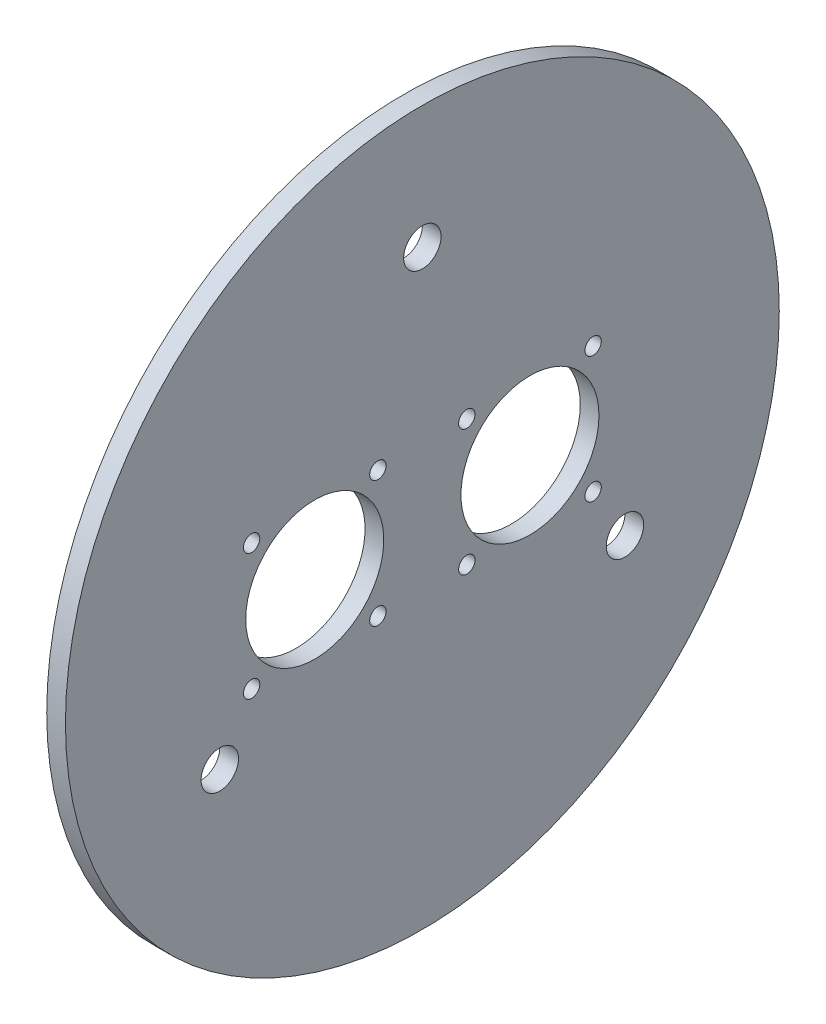
ISO-10303-21;
HEADER;
FILE_DESCRIPTION(('STEP AP214'),'2;1');
FILE_NAME('part.step','',(''),(''),'','','');
FILE_SCHEMA(('AUTOMOTIVE_DESIGN { 1 0 10303 214 1 1 1 1 }'));
ENDSEC;
DATA;
#1=APPLICATION_CONTEXT('core data for automotive mechanical design processes');
#2=APPLICATION_PROTOCOL_DEFINITION('international standard','automotive_design',2000,#1);
#3=PRODUCT_CONTEXT('',#1,'mechanical');
#4=PRODUCT('Part','Part','',(#3));
#5=PRODUCT_RELATED_PRODUCT_CATEGORY('part','',(#4));
#6=PRODUCT_DEFINITION_FORMATION('','',#4);
#7=PRODUCT_DEFINITION_CONTEXT('part definition',#1,'design');
#8=PRODUCT_DEFINITION('design','',#6,#7);
#9=PRODUCT_DEFINITION_SHAPE('','',#8);
#10=(LENGTH_UNIT() NAMED_UNIT(*) SI_UNIT(.MILLI.,.METRE.));
#11=(NAMED_UNIT(*) PLANE_ANGLE_UNIT() SI_UNIT($,.RADIAN.));
#12=(NAMED_UNIT(*) SI_UNIT($,.STERADIAN.) SOLID_ANGLE_UNIT());
#13=UNCERTAINTY_MEASURE_WITH_UNIT(LENGTH_MEASURE(1.E-05),#10,'distance_accuracy_value','');
#14=(GEOMETRIC_REPRESENTATION_CONTEXT(3) GLOBAL_UNCERTAINTY_ASSIGNED_CONTEXT((#13)) GLOBAL_UNIT_ASSIGNED_CONTEXT((#10,
#11,#12)) REPRESENTATION_CONTEXT('',''));
#15=CARTESIAN_POINT('',(0.,0.,0.));
#16=DIRECTION('',(0.,0.,1.));
#17=DIRECTION('',(1.,0.,0.));
#18=AXIS2_PLACEMENT_3D('',#15,#16,#17);
#19=CARTESIAN_POINT('',(4.,0.,0.));
#20=DIRECTION('',(1.,0.,0.));
#21=DIRECTION('',(0.,0.,-1.));
#22=AXIS2_PLACEMENT_3D('',#19,#20,#21);
#23=PLANE('',#22);
#24=CARTESIAN_POINT('',(4.,13.4969006858982,9.50309931410175));
#25=DIRECTION('',(1.,0.,0.));
#26=DIRECTION('',(0.,0.,1.));
#27=AXIS2_PLACEMENT_3D('',#24,#25,#26);
#28=CIRCLE('',#27,1.75000000000001);
#29=CARTESIAN_POINT('',(4.,13.4969006858982,11.2530993141018));
#30=VERTEX_POINT('',#29);
#31=EDGE_CURVE('E107',#30,#30,#28,.T.);
#32=ORIENTED_EDGE('',*,*,#31,.F.);
#33=EDGE_LOOP('',(#32));
#34=FACE_BOUND('',#33,.T.);
#35=CARTESIAN_POINT('',(4.,13.4969006858982,-9.50309931410175));
#36=DIRECTION('',(1.,0.,0.));
#37=DIRECTION('',(0.,0.,-1.));
#38=AXIS2_PLACEMENT_3D('',#35,#36,#37);
#39=CIRCLE('',#38,1.75000000000001);
#40=CARTESIAN_POINT('',(4.,13.4969006858982,-11.2530993141018));
#41=VERTEX_POINT('',#40);
#42=EDGE_CURVE('E95',#41,#41,#39,.T.);
#43=ORIENTED_EDGE('',*,*,#42,.F.);
#44=EDGE_LOOP('',(#43));
#45=FACE_BOUND('',#44,.T.);
#46=CARTESIAN_POINT('',(4.,-13.4969006858982,-36.4969006858983));
#47=DIRECTION('',(1.,0.,0.));
#48=DIRECTION('',(0.,0.,-1.));
#49=AXIS2_PLACEMENT_3D('',#46,#47,#48);
#50=CIRCLE('',#49,1.75);
#51=CARTESIAN_POINT('',(4.,-13.4969006858982,-38.2469006858983));
#52=VERTEX_POINT('',#51);
#53=EDGE_CURVE('E83',#52,#52,#50,.T.);
#54=ORIENTED_EDGE('',*,*,#53,.F.);
#55=EDGE_LOOP('',(#54));
#56=FACE_BOUND('',#55,.T.);
#57=CARTESIAN_POINT('',(4.,13.4969006858983,-36.4969006858982));
#58=DIRECTION('',(1.,0.,0.));
#59=DIRECTION('',(0.,0.,-1.));
#60=AXIS2_PLACEMENT_3D('',#57,#58,#59);
#61=CIRCLE('',#60,1.75);
#62=CARTESIAN_POINT('',(4.,13.4969006858983,-38.2469006858982));
#63=VERTEX_POINT('',#62);
#64=EDGE_CURVE('E71',#63,#63,#61,.T.);
#65=ORIENTED_EDGE('',*,*,#64,.F.);
#66=EDGE_LOOP('',(#65));
#67=FACE_BOUND('',#66,.T.);
#68=CARTESIAN_POINT('',(4.,0.,-23.));
#69=DIRECTION('',(1.,0.,0.));
#70=DIRECTION('',(0.,0.,-1.));
#71=AXIS2_PLACEMENT_3D('',#68,#69,#70);
#72=CIRCLE('',#71,14.75);
#73=CARTESIAN_POINT('',(4.,0.,-37.75));
#74=VERTEX_POINT('',#73);
#75=EDGE_CURVE('E59',#74,#74,#72,.T.);
#76=ORIENTED_EDGE('',*,*,#75,.F.);
#77=EDGE_LOOP('',(#76));
#78=FACE_BOUND('',#77,.T.);
#79=CARTESIAN_POINT('',(4.,-25.,-43.3012701892219));
#80=DIRECTION('',(1.,0.,0.));
#81=DIRECTION('',(0.,0.,-1.));
#82=AXIS2_PLACEMENT_3D('',#79,#80,#81);
#83=CIRCLE('',#82,4.00000000000001);
#84=CARTESIAN_POINT('',(4.,-25.,-47.301270189222));
#85=VERTEX_POINT('',#84);
#86=EDGE_CURVE('E47',#85,#85,#83,.T.);
#87=ORIENTED_EDGE('',*,*,#86,.F.);
#88=EDGE_LOOP('',(#87));
#89=FACE_BOUND('',#88,.T.);
#90=CARTESIAN_POINT('',(4.,0.,0.));
#91=DIRECTION('',(1.,0.,0.));
#92=DIRECTION('',(0.,0.,-1.));
#93=AXIS2_PLACEMENT_3D('',#90,#91,#92);
#94=CIRCLE('',#93,76.29);
#95=CARTESIAN_POINT('',(4.,0.,-76.29));
#96=VERTEX_POINT('',#95);
#97=EDGE_CURVE('E10',#96,#96,#94,.T.);
#98=ORIENTED_EDGE('',*,*,#97,.T.);
#99=EDGE_LOOP('',(#98));
#100=FACE_BOUND('',#99,.T.);
#101=CARTESIAN_POINT('',(4.,50.,0.));
#102=DIRECTION('',(1.,0.,0.));
#103=DIRECTION('',(0.,0.,-1.));
#104=AXIS2_PLACEMENT_3D('',#101,#102,#103);
#105=CIRCLE('',#104,4.00000000000001);
#106=CARTESIAN_POINT('',(4.,50.,-4.00000000000001));
#107=VERTEX_POINT('',#106);
#108=EDGE_CURVE('E42',#107,#107,#105,.T.);
#109=ORIENTED_EDGE('',*,*,#108,.F.);
#110=EDGE_LOOP('',(#109));
#111=FACE_BOUND('',#110,.T.);
#112=CARTESIAN_POINT('',(4.,-25.,43.3012701892219));
#113=DIRECTION('',(1.,0.,0.));
#114=DIRECTION('',(0.,0.,-1.));
#115=AXIS2_PLACEMENT_3D('',#112,#113,#114);
#116=CIRCLE('',#115,4.00000000000001);
#117=CARTESIAN_POINT('',(4.,-25.,39.3012701892219));
#118=VERTEX_POINT('',#117);
#119=EDGE_CURVE('E53',#118,#118,#116,.T.);
#120=ORIENTED_EDGE('',*,*,#119,.F.);
#121=EDGE_LOOP('',(#120));
#122=FACE_BOUND('',#121,.T.);
#123=CARTESIAN_POINT('',(4.,-13.4969006858982,36.4969006858983));
#124=DIRECTION('',(1.,0.,0.));
#125=DIRECTION('',(0.,0.,1.));
#126=AXIS2_PLACEMENT_3D('',#123,#124,#125);
#127=CIRCLE('',#126,1.75);
#128=CARTESIAN_POINT('',(4.,-13.4969006858982,38.2469006858983));
#129=VERTEX_POINT('',#128);
#130=EDGE_CURVE('E65',#129,#129,#127,.T.);
#131=ORIENTED_EDGE('',*,*,#130,.F.);
#132=EDGE_LOOP('',(#131));
#133=FACE_BOUND('',#132,.T.);
#134=CARTESIAN_POINT('',(4.,0.,23.));
#135=DIRECTION('',(1.,0.,0.));
#136=DIRECTION('',(0.,0.,1.));
#137=AXIS2_PLACEMENT_3D('',#134,#135,#136);
#138=CIRCLE('',#137,14.75);
#139=CARTESIAN_POINT('',(4.,0.,37.75));
#140=VERTEX_POINT('',#139);
#141=EDGE_CURVE('E77',#140,#140,#138,.T.);
#142=ORIENTED_EDGE('',*,*,#141,.F.);
#143=EDGE_LOOP('',(#142));
#144=FACE_BOUND('',#143,.T.);
#145=CARTESIAN_POINT('',(4.,-13.4969006858982,-9.5030993141018));
#146=DIRECTION('',(1.,0.,0.));
#147=DIRECTION('',(0.,0.,-1.));
#148=AXIS2_PLACEMENT_3D('',#145,#146,#147);
#149=CIRCLE('',#148,1.75000000000001);
#150=CARTESIAN_POINT('',(4.,-13.4969006858982,-11.2530993141018));
#151=VERTEX_POINT('',#150);
#152=EDGE_CURVE('E89',#151,#151,#149,.T.);
#153=ORIENTED_EDGE('',*,*,#152,.F.);
#154=EDGE_LOOP('',(#153));
#155=FACE_BOUND('',#154,.T.);
#156=CARTESIAN_POINT('',(4.,-13.4969006858982,9.5030993141018));
#157=DIRECTION('',(1.,0.,0.));
#158=DIRECTION('',(0.,0.,1.));
#159=AXIS2_PLACEMENT_3D('',#156,#157,#158);
#160=CIRCLE('',#159,1.75000000000001);
#161=CARTESIAN_POINT('',(4.,-13.4969006858982,11.2530993141018));
#162=VERTEX_POINT('',#161);
#163=EDGE_CURVE('E101',#162,#162,#160,.T.);
#164=ORIENTED_EDGE('',*,*,#163,.F.);
#165=EDGE_LOOP('',(#164));
#166=FACE_BOUND('',#165,.T.);
#167=CARTESIAN_POINT('',(4.,13.4969006858983,36.4969006858982));
#168=DIRECTION('',(1.,0.,0.));
#169=DIRECTION('',(0.,0.,1.));
#170=AXIS2_PLACEMENT_3D('',#167,#168,#169);
#171=CIRCLE('',#170,1.75);
#172=CARTESIAN_POINT('',(4.,13.4969006858983,38.2469006858982));
#173=VERTEX_POINT('',#172);
#174=EDGE_CURVE('E113',#173,#173,#171,.T.);
#175=ORIENTED_EDGE('',*,*,#174,.F.);
#176=EDGE_LOOP('',(#175));
#177=FACE_BOUND('',#176,.T.);
#178=ADVANCED_FACE('F31',(#34,#45,#56,#67,#78,#89,#100,#111,#122,#133,#144,#155,#166,#177),#23,.T.);
#179=CARTESIAN_POINT('',(0.,0.,0.));
#180=DIRECTION('',(1.,0.,0.));
#181=DIRECTION('',(0.,0.,-1.));
#182=AXIS2_PLACEMENT_3D('',#179,#180,#181);
#183=PLANE('',#182);
#184=CARTESIAN_POINT('',(0.,0.,0.));
#185=DIRECTION('',(1.,0.,0.));
#186=DIRECTION('',(0.,0.,-1.));
#187=AXIS2_PLACEMENT_3D('',#184,#185,#186);
#188=CIRCLE('',#187,76.29);
#189=CARTESIAN_POINT('',(0.,0.,-76.29));
#190=VERTEX_POINT('',#189);
#191=EDGE_CURVE('E35',#190,#190,#188,.T.);
#192=ORIENTED_EDGE('',*,*,#191,.F.);
#193=EDGE_LOOP('',(#192));
#194=FACE_BOUND('',#193,.T.);
#195=CARTESIAN_POINT('',(0.,50.,0.));
#196=DIRECTION('',(1.,0.,0.));
#197=DIRECTION('',(0.,0.,-1.));
#198=AXIS2_PLACEMENT_3D('',#195,#196,#197);
#199=CIRCLE('',#198,4.00000000000001);
#200=CARTESIAN_POINT('',(0.,50.,-4.00000000000001));
#201=VERTEX_POINT('',#200);
#202=EDGE_CURVE('E44',#201,#201,#199,.T.);
#203=ORIENTED_EDGE('',*,*,#202,.T.);
#204=EDGE_LOOP('',(#203));
#205=FACE_BOUND('',#204,.T.);
#206=CARTESIAN_POINT('',(0.,-25.,-43.3012701892219));
#207=DIRECTION('',(1.,0.,0.));
#208=DIRECTION('',(0.,0.,-1.));
#209=AXIS2_PLACEMENT_3D('',#206,#207,#208);
#210=CIRCLE('',#209,4.00000000000001);
#211=CARTESIAN_POINT('',(0.,-25.,-47.301270189222));
#212=VERTEX_POINT('',#211);
#213=EDGE_CURVE('E50',#212,#212,#210,.T.);
#214=ORIENTED_EDGE('',*,*,#213,.T.);
#215=EDGE_LOOP('',(#214));
#216=FACE_BOUND('',#215,.T.);
#217=CARTESIAN_POINT('',(0.,-25.,43.3012701892219));
#218=DIRECTION('',(1.,0.,0.));
#219=DIRECTION('',(0.,0.,-1.));
#220=AXIS2_PLACEMENT_3D('',#217,#218,#219);
#221=CIRCLE('',#220,4.00000000000001);
#222=CARTESIAN_POINT('',(0.,-25.,39.3012701892219));
#223=VERTEX_POINT('',#222);
#224=EDGE_CURVE('E56',#223,#223,#221,.T.);
#225=ORIENTED_EDGE('',*,*,#224,.T.);
#226=EDGE_LOOP('',(#225));
#227=FACE_BOUND('',#226,.T.);
#228=CARTESIAN_POINT('',(0.,0.,-23.));
#229=DIRECTION('',(1.,0.,0.));
#230=DIRECTION('',(0.,0.,-1.));
#231=AXIS2_PLACEMENT_3D('',#228,#229,#230);
#232=CIRCLE('',#231,14.75);
#233=CARTESIAN_POINT('',(0.,0.,-37.75));
#234=VERTEX_POINT('',#233);
#235=EDGE_CURVE('E62',#234,#234,#232,.T.);
#236=ORIENTED_EDGE('',*,*,#235,.T.);
#237=EDGE_LOOP('',(#236));
#238=FACE_BOUND('',#237,.T.);
#239=CARTESIAN_POINT('',(0.,-13.4969006858982,36.4969006858983));
#240=DIRECTION('',(1.,0.,0.));
#241=DIRECTION('',(0.,0.,1.));
#242=AXIS2_PLACEMENT_3D('',#239,#240,#241);
#243=CIRCLE('',#242,1.75);
#244=CARTESIAN_POINT('',(0.,-13.4969006858982,38.2469006858983));
#245=VERTEX_POINT('',#244);
#246=EDGE_CURVE('E68',#245,#245,#243,.T.);
#247=ORIENTED_EDGE('',*,*,#246,.T.);
#248=EDGE_LOOP('',(#247));
#249=FACE_BOUND('',#248,.T.);
#250=CARTESIAN_POINT('',(0.,13.4969006858983,-36.4969006858982));
#251=DIRECTION('',(1.,0.,0.));
#252=DIRECTION('',(0.,0.,-1.));
#253=AXIS2_PLACEMENT_3D('',#250,#251,#252);
#254=CIRCLE('',#253,1.75);
#255=CARTESIAN_POINT('',(0.,13.4969006858983,-38.2469006858982));
#256=VERTEX_POINT('',#255);
#257=EDGE_CURVE('E74',#256,#256,#254,.T.);
#258=ORIENTED_EDGE('',*,*,#257,.T.);
#259=EDGE_LOOP('',(#258));
#260=FACE_BOUND('',#259,.T.);
#261=CARTESIAN_POINT('',(0.,0.,23.));
#262=DIRECTION('',(1.,0.,0.));
#263=DIRECTION('',(0.,0.,1.));
#264=AXIS2_PLACEMENT_3D('',#261,#262,#263);
#265=CIRCLE('',#264,14.75);
#266=CARTESIAN_POINT('',(0.,0.,37.75));
#267=VERTEX_POINT('',#266);
#268=EDGE_CURVE('E80',#267,#267,#265,.T.);
#269=ORIENTED_EDGE('',*,*,#268,.T.);
#270=EDGE_LOOP('',(#269));
#271=FACE_BOUND('',#270,.T.);
#272=CARTESIAN_POINT('',(0.,-13.4969006858982,-36.4969006858983));
#273=DIRECTION('',(1.,0.,0.));
#274=DIRECTION('',(0.,0.,-1.));
#275=AXIS2_PLACEMENT_3D('',#272,#273,#274);
#276=CIRCLE('',#275,1.75);
#277=CARTESIAN_POINT('',(0.,-13.4969006858982,-38.2469006858983));
#278=VERTEX_POINT('',#277);
#279=EDGE_CURVE('E86',#278,#278,#276,.T.);
#280=ORIENTED_EDGE('',*,*,#279,.T.);
#281=EDGE_LOOP('',(#280));
#282=FACE_BOUND('',#281,.T.);
#283=CARTESIAN_POINT('',(0.,-13.4969006858982,-9.5030993141018));
#284=DIRECTION('',(1.,0.,0.));
#285=DIRECTION('',(0.,0.,-1.));
#286=AXIS2_PLACEMENT_3D('',#283,#284,#285);
#287=CIRCLE('',#286,1.75000000000001);
#288=CARTESIAN_POINT('',(0.,-13.4969006858982,-11.2530993141018));
#289=VERTEX_POINT('',#288);
#290=EDGE_CURVE('E92',#289,#289,#287,.T.);
#291=ORIENTED_EDGE('',*,*,#290,.T.);
#292=EDGE_LOOP('',(#291));
#293=FACE_BOUND('',#292,.T.);
#294=CARTESIAN_POINT('',(0.,13.4969006858982,-9.50309931410175));
#295=DIRECTION('',(1.,0.,0.));
#296=DIRECTION('',(0.,0.,-1.));
#297=AXIS2_PLACEMENT_3D('',#294,#295,#296);
#298=CIRCLE('',#297,1.75000000000001);
#299=CARTESIAN_POINT('',(0.,13.4969006858982,-11.2530993141018));
#300=VERTEX_POINT('',#299);
#301=EDGE_CURVE('E98',#300,#300,#298,.T.);
#302=ORIENTED_EDGE('',*,*,#301,.T.);
#303=EDGE_LOOP('',(#302));
#304=FACE_BOUND('',#303,.T.);
#305=CARTESIAN_POINT('',(0.,-13.4969006858982,9.5030993141018));
#306=DIRECTION('',(1.,0.,0.));
#307=DIRECTION('',(0.,0.,1.));
#308=AXIS2_PLACEMENT_3D('',#305,#306,#307);
#309=CIRCLE('',#308,1.75000000000001);
#310=CARTESIAN_POINT('',(0.,-13.4969006858982,11.2530993141018));
#311=VERTEX_POINT('',#310);
#312=EDGE_CURVE('E104',#311,#311,#309,.T.);
#313=ORIENTED_EDGE('',*,*,#312,.T.);
#314=EDGE_LOOP('',(#313));
#315=FACE_BOUND('',#314,.T.);
#316=CARTESIAN_POINT('',(0.,13.4969006858982,9.50309931410175));
#317=DIRECTION('',(1.,0.,0.));
#318=DIRECTION('',(0.,0.,1.));
#319=AXIS2_PLACEMENT_3D('',#316,#317,#318);
#320=CIRCLE('',#319,1.75000000000001);
#321=CARTESIAN_POINT('',(0.,13.4969006858982,11.2530993141018));
#322=VERTEX_POINT('',#321);
#323=EDGE_CURVE('E110',#322,#322,#320,.T.);
#324=ORIENTED_EDGE('',*,*,#323,.T.);
#325=EDGE_LOOP('',(#324));
#326=FACE_BOUND('',#325,.T.);
#327=CARTESIAN_POINT('',(0.,13.4969006858983,36.4969006858982));
#328=DIRECTION('',(1.,0.,0.));
#329=DIRECTION('',(0.,0.,1.));
#330=AXIS2_PLACEMENT_3D('',#327,#328,#329);
#331=CIRCLE('',#330,1.75);
#332=CARTESIAN_POINT('',(0.,13.4969006858983,38.2469006858982));
#333=VERTEX_POINT('',#332);
#334=EDGE_CURVE('E116',#333,#333,#331,.T.);
#335=ORIENTED_EDGE('',*,*,#334,.T.);
#336=EDGE_LOOP('',(#335));
#337=FACE_BOUND('',#336,.T.);
#338=ADVANCED_FACE('F126',(#194,#205,#216,#227,#238,#249,#260,#271,#282,#293,#304,#315,#326,
#337),#183,.F.);
#339=CARTESIAN_POINT('',(4.,0.,0.));
#340=DIRECTION('',(-1.,0.,0.));
#341=DIRECTION('',(0.,0.,1.));
#342=AXIS2_PLACEMENT_3D('',#339,#340,#341);
#343=CYLINDRICAL_SURFACE('',#342,76.29);
#344=ORIENTED_EDGE('',*,*,#97,.F.);
#345=EDGE_LOOP('',(#344));
#346=FACE_BOUND('',#345,.T.);
#347=ORIENTED_EDGE('',*,*,#191,.T.);
#348=EDGE_LOOP('',(#347));
#349=FACE_BOUND('',#348,.T.);
#350=ADVANCED_FACE('F33',(#346,#349),#343,.T.);
#351=CARTESIAN_POINT('',(4.,50.,0.));
#352=DIRECTION('',(-1.,0.,0.));
#353=DIRECTION('',(0.,0.,1.));
#354=AXIS2_PLACEMENT_3D('',#351,#352,#353);
#355=CYLINDRICAL_SURFACE('',#354,4.00000000000001);
#356=ORIENTED_EDGE('',*,*,#108,.T.);
#357=EDGE_LOOP('',(#356));
#358=FACE_BOUND('',#357,.T.);
#359=ORIENTED_EDGE('',*,*,#202,.F.);
#360=EDGE_LOOP('',(#359));
#361=FACE_BOUND('',#360,.T.);
#362=ADVANCED_FACE('F136',(#358,#361),#355,.F.);
#363=CARTESIAN_POINT('',(4.,-25.,-43.3012701892219));
#364=DIRECTION('',(-1.,0.,0.));
#365=DIRECTION('',(0.,0.,1.));
#366=AXIS2_PLACEMENT_3D('',#363,#364,#365);
#367=CYLINDRICAL_SURFACE('',#366,4.00000000000001);
#368=ORIENTED_EDGE('',*,*,#86,.T.);
#369=EDGE_LOOP('',(#368));
#370=FACE_BOUND('',#369,.T.);
#371=ORIENTED_EDGE('',*,*,#213,.F.);
#372=EDGE_LOOP('',(#371));
#373=FACE_BOUND('',#372,.T.);
#374=ADVANCED_FACE('F139',(#370,#373),#367,.F.);
#375=CARTESIAN_POINT('',(4.,-25.,43.3012701892219));
#376=DIRECTION('',(-1.,0.,0.));
#377=DIRECTION('',(0.,0.,1.));
#378=AXIS2_PLACEMENT_3D('',#375,#376,#377);
#379=CYLINDRICAL_SURFACE('',#378,4.00000000000001);
#380=ORIENTED_EDGE('',*,*,#119,.T.);
#381=EDGE_LOOP('',(#380));
#382=FACE_BOUND('',#381,.T.);
#383=ORIENTED_EDGE('',*,*,#224,.F.);
#384=EDGE_LOOP('',(#383));
#385=FACE_BOUND('',#384,.T.);
#386=ADVANCED_FACE('F143',(#382,#385),#379,.F.);
#387=CARTESIAN_POINT('',(4.,0.,-23.));
#388=DIRECTION('',(-1.,0.,0.));
#389=DIRECTION('',(0.,0.,1.));
#390=AXIS2_PLACEMENT_3D('',#387,#388,#389);
#391=CYLINDRICAL_SURFACE('',#390,14.75);
#392=ORIENTED_EDGE('',*,*,#75,.T.);
#393=EDGE_LOOP('',(#392));
#394=FACE_BOUND('',#393,.T.);
#395=ORIENTED_EDGE('',*,*,#235,.F.);
#396=EDGE_LOOP('',(#395));
#397=FACE_BOUND('',#396,.T.);
#398=ADVANCED_FACE('F147',(#394,#397),#391,.F.);
#399=CARTESIAN_POINT('',(4.,-13.4969006858982,36.4969006858983));
#400=DIRECTION('',(-1.,0.,0.));
#401=DIRECTION('',(0.,0.,1.));
#402=AXIS2_PLACEMENT_3D('',#399,#400,#401);
#403=CYLINDRICAL_SURFACE('',#402,1.75);
#404=ORIENTED_EDGE('',*,*,#130,.T.);
#405=EDGE_LOOP('',(#404));
#406=FACE_BOUND('',#405,.T.);
#407=ORIENTED_EDGE('',*,*,#246,.F.);
#408=EDGE_LOOP('',(#407));
#409=FACE_BOUND('',#408,.T.);
#410=ADVANCED_FACE('F151',(#406,#409),#403,.F.);
#411=CARTESIAN_POINT('',(4.,13.4969006858983,-36.4969006858982));
#412=DIRECTION('',(-1.,0.,0.));
#413=DIRECTION('',(0.,0.,1.));
#414=AXIS2_PLACEMENT_3D('',#411,#412,#413);
#415=CYLINDRICAL_SURFACE('',#414,1.75);
#416=ORIENTED_EDGE('',*,*,#64,.T.);
#417=EDGE_LOOP('',(#416));
#418=FACE_BOUND('',#417,.T.);
#419=ORIENTED_EDGE('',*,*,#257,.F.);
#420=EDGE_LOOP('',(#419));
#421=FACE_BOUND('',#420,.T.);
#422=ADVANCED_FACE('F155',(#418,#421),#415,.F.);
#423=CARTESIAN_POINT('',(4.,0.,23.));
#424=DIRECTION('',(-1.,0.,0.));
#425=DIRECTION('',(0.,0.,1.));
#426=AXIS2_PLACEMENT_3D('',#423,#424,#425);
#427=CYLINDRICAL_SURFACE('',#426,14.75);
#428=ORIENTED_EDGE('',*,*,#141,.T.);
#429=EDGE_LOOP('',(#428));
#430=FACE_BOUND('',#429,.T.);
#431=ORIENTED_EDGE('',*,*,#268,.F.);
#432=EDGE_LOOP('',(#431));
#433=FACE_BOUND('',#432,.T.);
#434=ADVANCED_FACE('F159',(#430,#433),#427,.F.);
#435=CARTESIAN_POINT('',(4.,-13.4969006858982,-36.4969006858983));
#436=DIRECTION('',(-1.,0.,0.));
#437=DIRECTION('',(0.,0.,1.));
#438=AXIS2_PLACEMENT_3D('',#435,#436,#437);
#439=CYLINDRICAL_SURFACE('',#438,1.75);
#440=ORIENTED_EDGE('',*,*,#53,.T.);
#441=EDGE_LOOP('',(#440));
#442=FACE_BOUND('',#441,.T.);
#443=ORIENTED_EDGE('',*,*,#279,.F.);
#444=EDGE_LOOP('',(#443));
#445=FACE_BOUND('',#444,.T.);
#446=ADVANCED_FACE('F163',(#442,#445),#439,.F.);
#447=CARTESIAN_POINT('',(4.,-13.4969006858982,-9.5030993141018));
#448=DIRECTION('',(-1.,0.,0.));
#449=DIRECTION('',(0.,0.,1.));
#450=AXIS2_PLACEMENT_3D('',#447,#448,#449);
#451=CYLINDRICAL_SURFACE('',#450,1.75000000000001);
#452=ORIENTED_EDGE('',*,*,#152,.T.);
#453=EDGE_LOOP('',(#452));
#454=FACE_BOUND('',#453,.T.);
#455=ORIENTED_EDGE('',*,*,#290,.F.);
#456=EDGE_LOOP('',(#455));
#457=FACE_BOUND('',#456,.T.);
#458=ADVANCED_FACE('F167',(#454,#457),#451,.F.);
#459=CARTESIAN_POINT('',(4.,13.4969006858982,-9.50309931410175));
#460=DIRECTION('',(-1.,0.,0.));
#461=DIRECTION('',(0.,0.,1.));
#462=AXIS2_PLACEMENT_3D('',#459,#460,#461);
#463=CYLINDRICAL_SURFACE('',#462,1.75000000000001);
#464=ORIENTED_EDGE('',*,*,#42,.T.);
#465=EDGE_LOOP('',(#464));
#466=FACE_BOUND('',#465,.T.);
#467=ORIENTED_EDGE('',*,*,#301,.F.);
#468=EDGE_LOOP('',(#467));
#469=FACE_BOUND('',#468,.T.);
#470=ADVANCED_FACE('F171',(#466,#469),#463,.F.);
#471=CARTESIAN_POINT('',(4.,-13.4969006858982,9.5030993141018));
#472=DIRECTION('',(-1.,0.,0.));
#473=DIRECTION('',(0.,0.,1.));
#474=AXIS2_PLACEMENT_3D('',#471,#472,#473);
#475=CYLINDRICAL_SURFACE('',#474,1.75000000000001);
#476=ORIENTED_EDGE('',*,*,#163,.T.);
#477=EDGE_LOOP('',(#476));
#478=FACE_BOUND('',#477,.T.);
#479=ORIENTED_EDGE('',*,*,#312,.F.);
#480=EDGE_LOOP('',(#479));
#481=FACE_BOUND('',#480,.T.);
#482=ADVANCED_FACE('F175',(#478,#481),#475,.F.);
#483=CARTESIAN_POINT('',(4.,13.4969006858982,9.50309931410175));
#484=DIRECTION('',(-1.,0.,0.));
#485=DIRECTION('',(0.,0.,1.));
#486=AXIS2_PLACEMENT_3D('',#483,#484,#485);
#487=CYLINDRICAL_SURFACE('',#486,1.75000000000001);
#488=ORIENTED_EDGE('',*,*,#31,.T.);
#489=EDGE_LOOP('',(#488));
#490=FACE_BOUND('',#489,.T.);
#491=ORIENTED_EDGE('',*,*,#323,.F.);
#492=EDGE_LOOP('',(#491));
#493=FACE_BOUND('',#492,.T.);
#494=ADVANCED_FACE('F179',(#490,#493),#487,.F.);
#495=CARTESIAN_POINT('',(4.,13.4969006858983,36.4969006858982));
#496=DIRECTION('',(-1.,0.,0.));
#497=DIRECTION('',(0.,0.,1.));
#498=AXIS2_PLACEMENT_3D('',#495,#496,#497);
#499=CYLINDRICAL_SURFACE('',#498,1.75);
#500=ORIENTED_EDGE('',*,*,#174,.T.);
#501=EDGE_LOOP('',(#500));
#502=FACE_BOUND('',#501,.T.);
#503=ORIENTED_EDGE('',*,*,#334,.F.);
#504=EDGE_LOOP('',(#503));
#505=FACE_BOUND('',#504,.T.);
#506=ADVANCED_FACE('F122',(#502,#505),#499,.F.);
#507=CLOSED_SHELL('',(#178,#338,#350,#362,#374,#386,#398,#410,#422,#434,#446,#458,#470,#482,
#494,#506));
#508=MANIFOLD_SOLID_BREP('B2',#507);
#509=ADVANCED_BREP_SHAPE_REPRESENTATION('',(#18,#508),#14);
#510=SHAPE_DEFINITION_REPRESENTATION(#9,#509);
ENDSEC;
END-ISO-10303-21;
